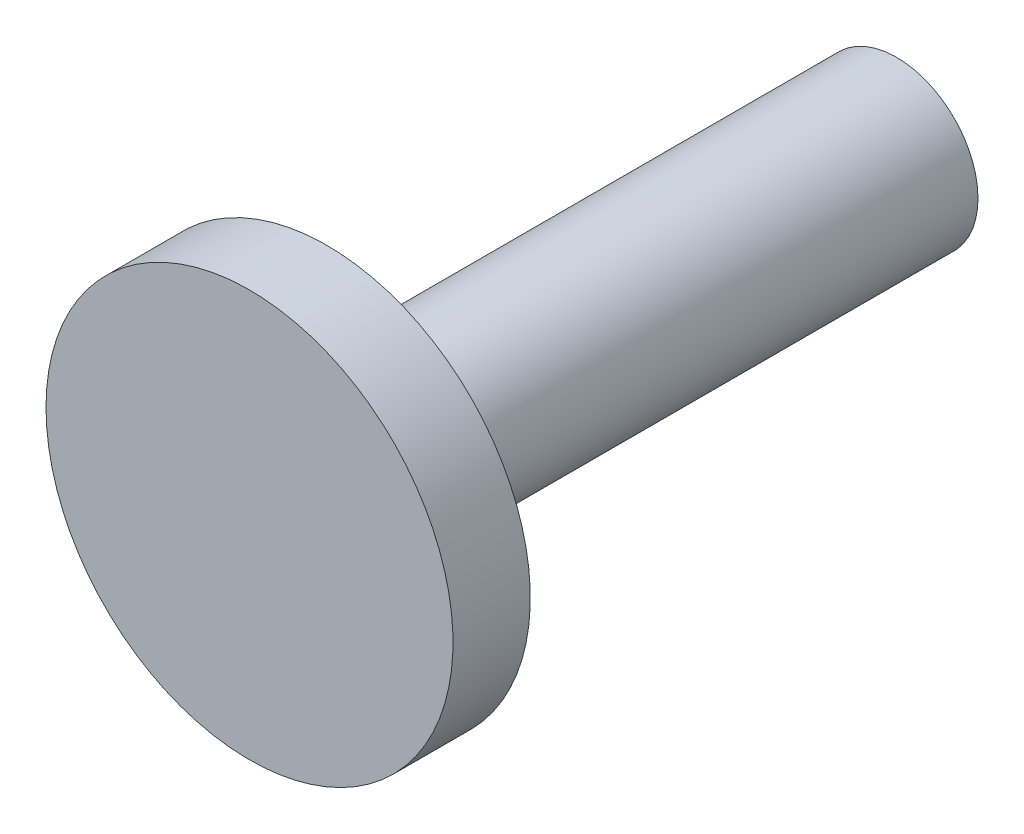
ISO-10303-21;
HEADER;
FILE_DESCRIPTION(('STEP AP214'),'2;1');
FILE_NAME('part.step','',(''),(''),'','','');
FILE_SCHEMA(('AUTOMOTIVE_DESIGN { 1 0 10303 214 1 1 1 1 }'));
ENDSEC;
DATA;
#1=APPLICATION_CONTEXT('core data for automotive mechanical design processes');
#2=APPLICATION_PROTOCOL_DEFINITION('international standard','automotive_design',2000,#1);
#3=PRODUCT_CONTEXT('',#1,'mechanical');
#4=PRODUCT('Part','Part','',(#3));
#5=PRODUCT_RELATED_PRODUCT_CATEGORY('part','',(#4));
#6=PRODUCT_DEFINITION_FORMATION('','',#4);
#7=PRODUCT_DEFINITION_CONTEXT('part definition',#1,'design');
#8=PRODUCT_DEFINITION('design','',#6,#7);
#9=PRODUCT_DEFINITION_SHAPE('','',#8);
#10=(LENGTH_UNIT() NAMED_UNIT(*) SI_UNIT(.MILLI.,.METRE.));
#11=(NAMED_UNIT(*) PLANE_ANGLE_UNIT() SI_UNIT($,.RADIAN.));
#12=(NAMED_UNIT(*) SI_UNIT($,.STERADIAN.) SOLID_ANGLE_UNIT());
#13=UNCERTAINTY_MEASURE_WITH_UNIT(LENGTH_MEASURE(1.E-05),#10,'distance_accuracy_value','');
#14=(GEOMETRIC_REPRESENTATION_CONTEXT(3) GLOBAL_UNCERTAINTY_ASSIGNED_CONTEXT((#13)) GLOBAL_UNIT_ASSIGNED_CONTEXT((#10,
#11,#12)) REPRESENTATION_CONTEXT('',''));
#15=CARTESIAN_POINT('',(0.,0.,0.));
#16=DIRECTION('',(0.,0.,1.));
#17=DIRECTION('',(1.,0.,0.));
#18=AXIS2_PLACEMENT_3D('',#15,#16,#17);
#19=CARTESIAN_POINT('',(0.,0.,-1.9));
#20=DIRECTION('',(0.,0.,1.));
#21=DIRECTION('',(-1.,0.,0.));
#22=AXIS2_PLACEMENT_3D('',#19,#20,#21);
#23=CYLINDRICAL_SURFACE('',#22,5.);
#24=CARTESIAN_POINT('',(0.,0.,-1.9));
#25=DIRECTION('',(0.,0.,1.));
#26=DIRECTION('',(1.,0.,0.));
#27=AXIS2_PLACEMENT_3D('',#24,#25,#26);
#28=CIRCLE('',#27,5.);
#29=CARTESIAN_POINT('',(-5.,0.,-1.9));
#30=VERTEX_POINT('',#29);
#31=EDGE_CURVE('E10',#30,#30,#28,.T.);
#32=CARTESIAN_POINT('',(0.,0.,0.));
#33=DIRECTION('',(0.,0.,1.));
#34=DIRECTION('',(1.,0.,0.));
#35=AXIS2_PLACEMENT_3D('',#32,#33,#34);
#36=CIRCLE('',#35,5.);
#37=CARTESIAN_POINT('',(-5.,0.,0.));
#38=VERTEX_POINT('',#37);
#39=EDGE_CURVE('E40',#38,#38,#36,.T.);
#40=CARTESIAN_POINT('',(-5.,0.,-1.9));
#41=CARTESIAN_POINT('',(-5.,0.,-1.88020833333333));
#42=CARTESIAN_POINT('',(-5.,0.,-1.86041666666667));
#43=CARTESIAN_POINT('',(-5.,0.,-1.82083333333333));
#44=CARTESIAN_POINT('',(-5.,0.,-1.80104166666667));
#45=CARTESIAN_POINT('',(-5.,0.,-1.76145833333333));
#46=CARTESIAN_POINT('',(-5.,0.,-1.74166666666667));
#47=CARTESIAN_POINT('',(-5.,0.,-1.70208333333333));
#48=CARTESIAN_POINT('',(-5.,0.,-1.68229166666667));
#49=CARTESIAN_POINT('',(-5.,0.,-1.64270833333333));
#50=CARTESIAN_POINT('',(-5.,0.,-1.62291666666667));
#51=CARTESIAN_POINT('',(-5.,0.,-1.58333333333333));
#52=CARTESIAN_POINT('',(-5.,0.,-1.56354166666667));
#53=CARTESIAN_POINT('',(-5.,0.,-1.52395833333333));
#54=CARTESIAN_POINT('',(-5.,0.,-1.50416666666667));
#55=CARTESIAN_POINT('',(-5.,0.,-1.46458333333333));
#56=CARTESIAN_POINT('',(-5.,0.,-1.44479166666667));
#57=CARTESIAN_POINT('',(-5.,0.,-1.40520833333333));
#58=CARTESIAN_POINT('',(-5.,0.,-1.38541666666667));
#59=CARTESIAN_POINT('',(-5.,0.,-1.34583333333333));
#60=CARTESIAN_POINT('',(-5.,0.,-1.32604166666667));
#61=CARTESIAN_POINT('',(-5.,0.,-1.28645833333333));
#62=CARTESIAN_POINT('',(-5.,0.,-1.26666666666667));
#63=CARTESIAN_POINT('',(-5.,0.,-1.22708333333333));
#64=CARTESIAN_POINT('',(-5.,0.,-1.20729166666667));
#65=CARTESIAN_POINT('',(-5.,0.,-1.16770833333333));
#66=CARTESIAN_POINT('',(-5.,0.,-1.14791666666667));
#67=CARTESIAN_POINT('',(-5.,0.,-1.10833333333333));
#68=CARTESIAN_POINT('',(-5.,0.,-1.08854166666667));
#69=CARTESIAN_POINT('',(-5.,0.,-1.04895833333333));
#70=CARTESIAN_POINT('',(-5.,0.,-1.02916666666667));
#71=CARTESIAN_POINT('',(-5.,0.,-0.989583333333333));
#72=CARTESIAN_POINT('',(-5.,0.,-0.969791666666667));
#73=CARTESIAN_POINT('',(-5.,0.,-0.930208333333333));
#74=CARTESIAN_POINT('',(-5.,0.,-0.910416666666667));
#75=CARTESIAN_POINT('',(-5.,0.,-0.870833333333333));
#76=CARTESIAN_POINT('',(-5.,0.,-0.851041666666667));
#77=CARTESIAN_POINT('',(-5.,0.,-0.811458333333334));
#78=CARTESIAN_POINT('',(-5.,0.,-0.791666666666667));
#79=CARTESIAN_POINT('',(-5.,0.,-0.752083333333334));
#80=CARTESIAN_POINT('',(-5.,0.,-0.732291666666667));
#81=CARTESIAN_POINT('',(-5.,0.,-0.692708333333333));
#82=CARTESIAN_POINT('',(-5.,0.,-0.672916666666667));
#83=CARTESIAN_POINT('',(-5.,0.,-0.633333333333333));
#84=CARTESIAN_POINT('',(-5.,0.,-0.613541666666667));
#85=CARTESIAN_POINT('',(-5.,0.,-0.573958333333333));
#86=CARTESIAN_POINT('',(-5.,0.,-0.554166666666667));
#87=CARTESIAN_POINT('',(-5.,0.,-0.514583333333334));
#88=CARTESIAN_POINT('',(-5.,0.,-0.494791666666667));
#89=CARTESIAN_POINT('',(-5.,0.,-0.455208333333333));
#90=CARTESIAN_POINT('',(-5.,0.,-0.435416666666667));
#91=CARTESIAN_POINT('',(-5.,0.,-0.395833333333333));
#92=CARTESIAN_POINT('',(-5.,0.,-0.376041666666667));
#93=CARTESIAN_POINT('',(-5.,0.,-0.336458333333333));
#94=CARTESIAN_POINT('',(-5.,0.,-0.316666666666667));
#95=CARTESIAN_POINT('',(-5.,0.,-0.277083333333333));
#96=CARTESIAN_POINT('',(-5.,0.,-0.257291666666667));
#97=CARTESIAN_POINT('',(-5.,0.,-0.217708333333333));
#98=CARTESIAN_POINT('',(-5.,0.,-0.197916666666667));
#99=CARTESIAN_POINT('',(-5.,0.,-0.158333333333333));
#100=CARTESIAN_POINT('',(-5.,0.,-0.138541666666667));
#101=CARTESIAN_POINT('',(-5.,0.,-0.0989583333333333));
#102=CARTESIAN_POINT('',(-5.,0.,-0.0791666666666666));
#103=CARTESIAN_POINT('',(-5.,0.,-0.0395833333333333));
#104=CARTESIAN_POINT('',(-5.,0.,-0.0197916666666666));
#105=CARTESIAN_POINT('',(-5.,0.,0.));
#106=B_SPLINE_CURVE_WITH_KNOTS('',3,(#40,#41,#42,#43,#44,#45,#46,#47,#48,#49,#50,#51,#52,#53,
#54,#55,#56,#57,#58,#59,#60,#61,#62,#63,#64,#65,#66,#67,#68,#69,#70,#71,#72,#73,#74,#75,#76,#77,
#78,#79,#80,#81,#82,#83,#84,#85,#86,#87,#88,#89,#90,#91,#92,#93,#94,#95,#96,#97,#98,#99,#100,
#101,#102,#103,#104,#105),.UNSPECIFIED.,.F.,.F.,(4,2,2,2,2,2,2,2,2,2,2,2,2,2,2,2,2,2,2,2,2,2,2,
2,2,2,2,2,2,2,2,2,4),(0.,0.0593750000000002,0.11875,0.178125,0.2375,0.296875,0.35625,0.415625,
0.475,0.534375,0.59375,0.653125,0.7125,0.771875,0.83125,0.890625,0.95,1.009375,1.06875,1.128125,
1.1875,1.246875,1.30625,1.365625,1.425,1.484375,1.54375,1.603125,1.6625,1.721875,1.78125,
1.840625,1.9),.UNSPECIFIED.);
#107=EDGE_CURVE('BSEAM37',#30,#38,#106,.T.);
#108=ORIENTED_EDGE('',*,*,#31,.T.);
#109=ORIENTED_EDGE('',*,*,#39,.F.);
#110=ORIENTED_EDGE('',*,*,#107,.T.);
#111=ORIENTED_EDGE('',*,*,#107,.F.);
#112=EDGE_LOOP('',(#108,#110,#109,#111));
#113=FACE_BOUND('',#112,.T.);
#114=ADVANCED_FACE('F37',(#113),#23,.T.);
#115=CARTESIAN_POINT('',(0.,0.,-1.9));
#116=DIRECTION('',(0.,0.,-1.));
#117=DIRECTION('',(1.,0.,0.));
#118=AXIS2_PLACEMENT_3D('',#115,#116,#117);
#119=PLANE('',#118);
#120=CARTESIAN_POINT('',(0.,0.,-1.9));
#121=DIRECTION('',(0.,0.,1.));
#122=DIRECTION('',(1.,0.,0.));
#123=AXIS2_PLACEMENT_3D('',#120,#121,#122);
#124=CIRCLE('',#123,2.);
#125=CARTESIAN_POINT('',(2.,0.,-1.9));
#126=VERTEX_POINT('',#125);
#127=EDGE_CURVE('E49',#126,#126,#124,.T.);
#128=ORIENTED_EDGE('',*,*,#127,.T.);
#129=EDGE_LOOP('',(#128));
#130=FACE_BOUND('',#129,.T.);
#131=ORIENTED_EDGE('',*,*,#31,.F.);
#132=EDGE_LOOP('',(#131));
#133=FACE_BOUND('',#132,.T.);
#134=ADVANCED_FACE('F73',(#130,#133),#119,.T.);
#135=CARTESIAN_POINT('',(0.,0.,0.));
#136=DIRECTION('',(0.,0.,-1.));
#137=DIRECTION('',(1.,0.,0.));
#138=AXIS2_PLACEMENT_3D('',#135,#136,#137);
#139=PLANE('',#138);
#140=ORIENTED_EDGE('',*,*,#39,.T.);
#141=EDGE_LOOP('',(#140));
#142=FACE_BOUND('',#141,.T.);
#143=ADVANCED_FACE('F77',(#142),#139,.F.);
#144=CARTESIAN_POINT('',(0.,0.,-15.9));
#145=DIRECTION('',(0.,0.,1.));
#146=DIRECTION('',(-1.,0.,0.));
#147=AXIS2_PLACEMENT_3D('',#144,#145,#146);
#148=CYLINDRICAL_SURFACE('',#147,2.);
#149=CARTESIAN_POINT('',(0.,0.,-15.9));
#150=DIRECTION('',(0.,0.,1.));
#151=DIRECTION('',(1.,0.,0.));
#152=AXIS2_PLACEMENT_3D('',#149,#150,#151);
#153=CIRCLE('',#152,2.);
#154=CARTESIAN_POINT('',(2.,0.,-15.9));
#155=VERTEX_POINT('',#154);
#156=EDGE_CURVE('E47',#155,#155,#153,.T.);
#157=ORIENTED_EDGE('',*,*,#156,.T.);
#158=EDGE_LOOP('',(#157));
#159=FACE_BOUND('',#158,.T.);
#160=ORIENTED_EDGE('',*,*,#127,.F.);
#161=EDGE_LOOP('',(#160));
#162=FACE_BOUND('',#161,.T.);
#163=ADVANCED_FACE('F84',(#159,#162),#148,.T.);
#164=CARTESIAN_POINT('',(0.,0.,-15.9));
#165=DIRECTION('',(0.,0.,-1.));
#166=DIRECTION('',(1.,0.,0.));
#167=AXIS2_PLACEMENT_3D('',#164,#165,#166);
#168=PLANE('',#167);
#169=CARTESIAN_POINT('',(0.,0.,-15.9));
#170=DIRECTION('',(0.,0.,1.));
#171=DIRECTION('',(1.,0.,0.));
#172=AXIS2_PLACEMENT_3D('',#169,#170,#171);
#173=CIRCLE('',#172,1.5);
#174=CARTESIAN_POINT('',(1.5,0.,-15.9));
#175=VERTEX_POINT('',#174);
#176=EDGE_CURVE('E55',#175,#175,#173,.T.);
#177=ORIENTED_EDGE('',*,*,#176,.T.);
#178=EDGE_LOOP('',(#177));
#179=FACE_BOUND('',#178,.T.);
#180=ORIENTED_EDGE('',*,*,#156,.F.);
#181=EDGE_LOOP('',(#180));
#182=FACE_BOUND('',#181,.T.);
#183=ADVANCED_FACE('F70',(#179,#182),#168,.T.);
#184=CARTESIAN_POINT('',(0.,0.,-3.9));
#185=DIRECTION('',(0.,0.,-1.));
#186=DIRECTION('',(1.,0.,0.));
#187=AXIS2_PLACEMENT_3D('',#184,#185,#186);
#188=CYLINDRICAL_SURFACE('',#187,1.5);
#189=CARTESIAN_POINT('',(0.,0.,-3.9));
#190=DIRECTION('',(0.,0.,1.));
#191=DIRECTION('',(1.,0.,0.));
#192=AXIS2_PLACEMENT_3D('',#189,#190,#191);
#193=CIRCLE('',#192,1.5);
#194=CARTESIAN_POINT('',(1.5,0.,-3.9));
#195=VERTEX_POINT('',#194);
#196=EDGE_CURVE('E52',#195,#195,#193,.T.);
#197=ORIENTED_EDGE('',*,*,#196,.T.);
#198=EDGE_LOOP('',(#197));
#199=FACE_BOUND('',#198,.T.);
#200=ORIENTED_EDGE('',*,*,#176,.F.);
#201=EDGE_LOOP('',(#200));
#202=FACE_BOUND('',#201,.T.);
#203=ADVANCED_FACE('F61',(#199,#202),#188,.F.);
#204=CARTESIAN_POINT('',(0.,0.,-3.9));
#205=DIRECTION('',(0.,0.,-1.));
#206=DIRECTION('',(1.,0.,0.));
#207=AXIS2_PLACEMENT_3D('',#204,#205,#206);
#208=PLANE('',#207);
#209=ORIENTED_EDGE('',*,*,#196,.F.);
#210=EDGE_LOOP('',(#209));
#211=FACE_BOUND('',#210,.T.);
#212=ADVANCED_FACE('F64',(#211),#208,.T.);
#213=CLOSED_SHELL('',(#114,#134,#143,#163,#183,#203,#212));
#214=MANIFOLD_SOLID_BREP('B2',#213);
#215=ADVANCED_BREP_SHAPE_REPRESENTATION('',(#18,#214),#14);
#216=SHAPE_DEFINITION_REPRESENTATION(#9,#215);
ENDSEC;
END-ISO-10303-21;
